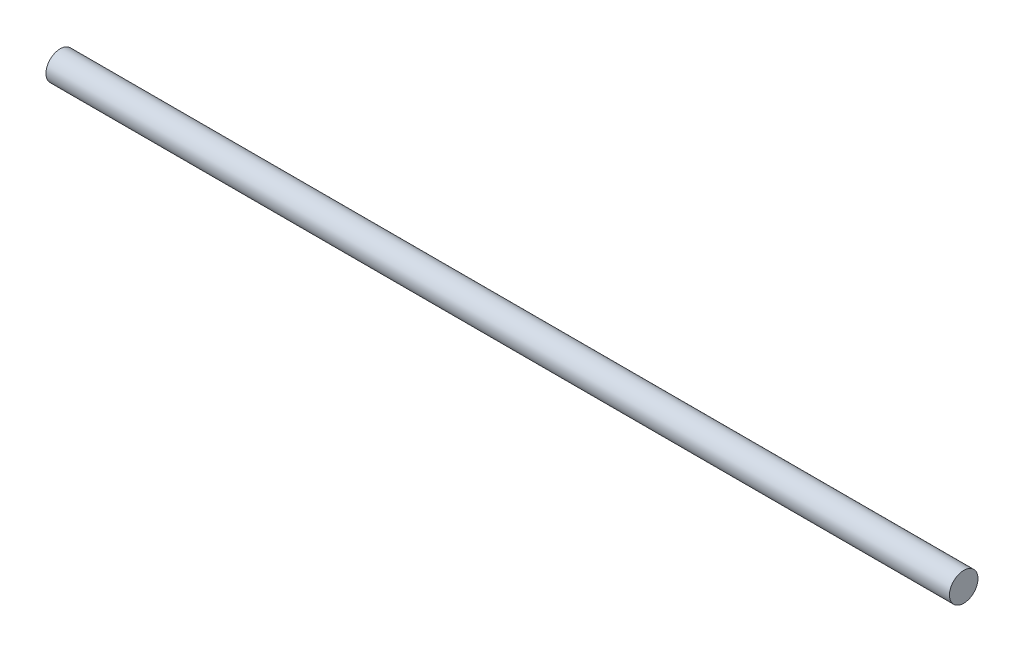
ISO-10303-21;
HEADER;
FILE_DESCRIPTION(('STEP AP214'),'2;1');
FILE_NAME('part.step','',(''),(''),'','','');
FILE_SCHEMA(('AUTOMOTIVE_DESIGN { 1 0 10303 214 1 1 1 1 }'));
ENDSEC;
DATA;
#1=APPLICATION_CONTEXT('core data for automotive mechanical design processes');
#2=APPLICATION_PROTOCOL_DEFINITION('international standard','automotive_design',2000,#1);
#3=PRODUCT_CONTEXT('',#1,'mechanical');
#4=PRODUCT('Part','Part','',(#3));
#5=PRODUCT_RELATED_PRODUCT_CATEGORY('part','',(#4));
#6=PRODUCT_DEFINITION_FORMATION('','',#4);
#7=PRODUCT_DEFINITION_CONTEXT('part definition',#1,'design');
#8=PRODUCT_DEFINITION('design','',#6,#7);
#9=PRODUCT_DEFINITION_SHAPE('','',#8);
#10=(LENGTH_UNIT() NAMED_UNIT(*) SI_UNIT(.MILLI.,.METRE.));
#11=(NAMED_UNIT(*) PLANE_ANGLE_UNIT() SI_UNIT($,.RADIAN.));
#12=(NAMED_UNIT(*) SI_UNIT($,.STERADIAN.) SOLID_ANGLE_UNIT());
#13=UNCERTAINTY_MEASURE_WITH_UNIT(LENGTH_MEASURE(1.E-05),#10,'distance_accuracy_value','');
#14=(GEOMETRIC_REPRESENTATION_CONTEXT(3) GLOBAL_UNCERTAINTY_ASSIGNED_CONTEXT((#13)) GLOBAL_UNIT_ASSIGNED_CONTEXT((#10,
#11,#12)) REPRESENTATION_CONTEXT('',''));
#15=CARTESIAN_POINT('',(0.,0.,0.));
#16=DIRECTION('',(0.,0.,1.));
#17=DIRECTION('',(1.,0.,0.));
#18=AXIS2_PLACEMENT_3D('',#15,#16,#17);
#19=CARTESIAN_POINT('',(95.,0.,0.));
#20=DIRECTION('',(-1.,0.,0.));
#21=DIRECTION('',(0.,0.,1.));
#22=AXIS2_PLACEMENT_3D('',#19,#20,#21);
#23=CYLINDRICAL_SURFACE('',#22,1.5);
#24=CARTESIAN_POINT('',(95.,0.,0.));
#25=DIRECTION('',(1.,0.,0.));
#26=DIRECTION('',(0.,0.,-1.));
#27=AXIS2_PLACEMENT_3D('',#24,#25,#26);
#28=CIRCLE('',#27,1.5);
#29=CARTESIAN_POINT('',(95.,0.,-1.5));
#30=VERTEX_POINT('',#29);
#31=EDGE_CURVE('E10',#30,#30,#28,.T.);
#32=ORIENTED_EDGE('',*,*,#31,.F.);
#33=EDGE_LOOP('',(#32));
#34=FACE_BOUND('',#33,.T.);
#35=CARTESIAN_POINT('',(0.,0.,0.));
#36=DIRECTION('',(1.,0.,0.));
#37=DIRECTION('',(0.,0.,-1.));
#38=AXIS2_PLACEMENT_3D('',#35,#36,#37);
#39=CIRCLE('',#38,1.5);
#40=CARTESIAN_POINT('',(0.,0.,-1.5));
#41=VERTEX_POINT('',#40);
#42=EDGE_CURVE('E34',#41,#41,#39,.T.);
#43=ORIENTED_EDGE('',*,*,#42,.T.);
#44=EDGE_LOOP('',(#43));
#45=FACE_BOUND('',#44,.T.);
#46=ADVANCED_FACE('F31',(#34,#45),#23,.T.);
#47=CARTESIAN_POINT('',(95.,0.,0.));
#48=DIRECTION('',(1.,0.,0.));
#49=DIRECTION('',(0.,0.,-1.));
#50=AXIS2_PLACEMENT_3D('',#47,#48,#49);
#51=PLANE('',#50);
#52=ORIENTED_EDGE('',*,*,#31,.T.);
#53=EDGE_LOOP('',(#52));
#54=FACE_BOUND('',#53,.T.);
#55=ADVANCED_FACE('F46',(#54),#51,.T.);
#56=CARTESIAN_POINT('',(0.,0.,0.));
#57=DIRECTION('',(1.,0.,0.));
#58=DIRECTION('',(0.,0.,-1.));
#59=AXIS2_PLACEMENT_3D('',#56,#57,#58);
#60=PLANE('',#59);
#61=ORIENTED_EDGE('',*,*,#42,.F.);
#62=EDGE_LOOP('',(#61));
#63=FACE_BOUND('',#62,.T.);
#64=ADVANCED_FACE('F44',(#63),#60,.F.);
#65=CLOSED_SHELL('',(#46,#55,#64));
#66=MANIFOLD_SOLID_BREP('B2',#65);
#67=ADVANCED_BREP_SHAPE_REPRESENTATION('',(#18,#66),#14);
#68=SHAPE_DEFINITION_REPRESENTATION(#9,#67);
ENDSEC;
END-ISO-10303-21;
